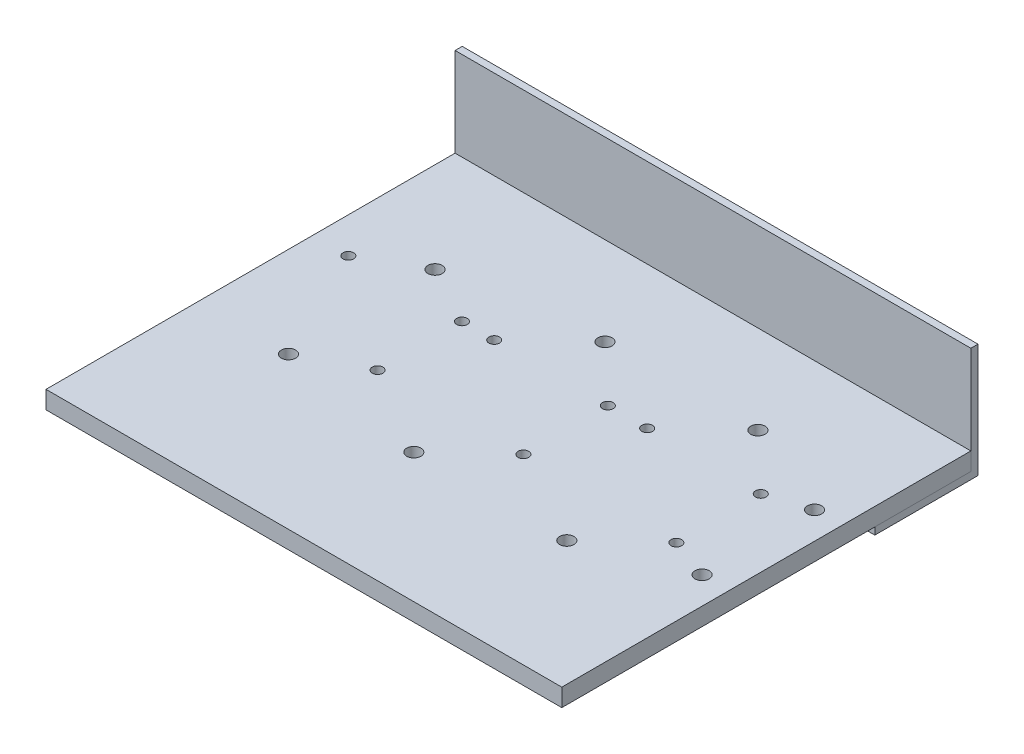
ISO-10303-21;
HEADER;
FILE_DESCRIPTION(('STEP AP214'),'2;1');
FILE_NAME('part.step','',(''),(''),'','','');
FILE_SCHEMA(('AUTOMOTIVE_DESIGN { 1 0 10303 214 1 1 1 1 }'));
ENDSEC;
DATA;
#1=APPLICATION_CONTEXT('core data for automotive mechanical design processes');
#2=APPLICATION_PROTOCOL_DEFINITION('international standard','automotive_design',2000,#1);
#3=PRODUCT_CONTEXT('',#1,'mechanical');
#4=PRODUCT('Part','Part','',(#3));
#5=PRODUCT_RELATED_PRODUCT_CATEGORY('part','',(#4));
#6=PRODUCT_DEFINITION_FORMATION('','',#4);
#7=PRODUCT_DEFINITION_CONTEXT('part definition',#1,'design');
#8=PRODUCT_DEFINITION('design','',#6,#7);
#9=PRODUCT_DEFINITION_SHAPE('','',#8);
#10=(LENGTH_UNIT() NAMED_UNIT(*) SI_UNIT(.MILLI.,.METRE.));
#11=(NAMED_UNIT(*) PLANE_ANGLE_UNIT() SI_UNIT($,.RADIAN.));
#12=(NAMED_UNIT(*) SI_UNIT($,.STERADIAN.) SOLID_ANGLE_UNIT());
#13=UNCERTAINTY_MEASURE_WITH_UNIT(LENGTH_MEASURE(1.E-05),#10,'distance_accuracy_value','');
#14=(GEOMETRIC_REPRESENTATION_CONTEXT(3) GLOBAL_UNCERTAINTY_ASSIGNED_CONTEXT((#13)) GLOBAL_UNIT_ASSIGNED_CONTEXT((#10,
#11,#12)) REPRESENTATION_CONTEXT('',''));
#15=CARTESIAN_POINT('',(0.,0.,0.));
#16=DIRECTION('',(0.,0.,1.));
#17=DIRECTION('',(1.,0.,0.));
#18=AXIS2_PLACEMENT_3D('',#15,#16,#17);
#19=CARTESIAN_POINT('',(72.5,0.,-30.5));
#20=DIRECTION('',(0.,0.,-1.));
#21=DIRECTION('',(-1.,0.,0.));
#22=AXIS2_PLACEMENT_3D('',#19,#20,#21);
#23=PLANE('',#22);
#24=DIRECTION('',(-1.,0.,0.));
#25=VECTOR('',#24,1.);
#26=CARTESIAN_POINT('',(72.5,0.,-30.5));
#27=LINE('',#26,#25);
#28=CARTESIAN_POINT('',(29.7920606326244,0.,-30.5));
#29=VERTEX_POINT('',#28);
#30=CARTESIAN_POINT('',(2.22061971478603,0.,-30.5));
#31=VERTEX_POINT('',#30);
#32=EDGE_CURVE('E145',#29,#31,#27,.T.);
#33=ORIENTED_EDGE('',*,*,#32,.T.);
#34=DIRECTION('',(0.,-1.,0.));
#35=VECTOR('',#34,1.);
#36=CARTESIAN_POINT('',(2.22061971478603,22.6274169979695,-30.5));
#37=LINE('',#36,#35);
#38=CARTESIAN_POINT('',(2.22061971478603,-2.,-30.5));
#39=VERTEX_POINT('',#38);
#40=EDGE_CURVE('E12',#31,#39,#37,.T.);
#41=ORIENTED_EDGE('',*,*,#40,.T.);
#42=DIRECTION('',(-1.,0.,0.));
#43=VECTOR('',#42,1.);
#44=CARTESIAN_POINT('',(72.5,-2.,-30.5));
#45=LINE('',#44,#43);
#46=CARTESIAN_POINT('',(29.7920606326244,-2.,-30.5));
#47=VERTEX_POINT('',#46);
#48=EDGE_CURVE('E142',#47,#39,#45,.T.);
#49=ORIENTED_EDGE('',*,*,#48,.F.);
#50=DIRECTION('',(0.,-1.,0.));
#51=VECTOR('',#50,1.);
#52=CARTESIAN_POINT('',(29.7920606326244,22.6274169979695,-30.5));
#53=LINE('',#52,#51);
#54=EDGE_CURVE('E122',#47,#29,#53,.F.);
#55=ORIENTED_EDGE('',*,*,#54,.T.);
#56=EDGE_LOOP('',(#33,#41,#49,#55));
#57=FACE_BOUND('',#56,.T.);
#58=ADVANCED_FACE('F43',(#57),#23,.F.);
#59=CARTESIAN_POINT('',(72.5,0.,-30.5));
#60=VERTEX_POINT('',#59);
#61=CARTESIAN_POINT('',(45.2206197147861,0.,-30.5));
#62=VERTEX_POINT('',#61);
#63=EDGE_CURVE('E136',#60,#62,#27,.T.);
#64=ORIENTED_EDGE('',*,*,#63,.T.);
#65=DIRECTION('',(0.,-1.,0.));
#66=VECTOR('',#65,1.);
#67=CARTESIAN_POINT('',(45.2206197147861,22.6274169979695,-30.5));
#68=LINE('',#67,#66);
#69=CARTESIAN_POINT('',(45.2206197147861,-2.,-30.5));
#70=VERTEX_POINT('',#69);
#71=EDGE_CURVE('E121',#62,#70,#68,.T.);
#72=ORIENTED_EDGE('',*,*,#71,.T.);
#73=CARTESIAN_POINT('',(72.5,-2.,-30.5));
#74=VERTEX_POINT('',#73);
#75=EDGE_CURVE('E133',#74,#70,#45,.T.);
#76=ORIENTED_EDGE('',*,*,#75,.F.);
#77=DIRECTION('',(0.,-1.,0.));
#78=VECTOR('',#77,1.);
#79=CARTESIAN_POINT('',(72.5,0.,-30.5));
#80=LINE('',#79,#78);
#81=EDGE_CURVE('E197',#60,#74,#80,.T.);
#82=ORIENTED_EDGE('',*,*,#81,.F.);
#83=EDGE_LOOP('',(#64,#72,#76,#82));
#84=FACE_BOUND('',#83,.T.);
#85=ADVANCED_FACE('F131',(#84),#23,.F.);
#86=CARTESIAN_POINT('',(72.5,-2.,-57.5));
#87=DIRECTION('',(0.,-1.,0.));
#88=DIRECTION('',(0.,0.,-1.));
#89=AXIS2_PLACEMENT_3D('',#86,#87,#88);
#90=PLANE('',#89);
#91=CARTESIAN_POINT('',(-5.49365982629481,-2.,-32.6189363279867));
#92=DIRECTION('',(0.,-1.,0.));
#93=DIRECTION('',(0.,0.,-1.));
#94=AXIS2_PLACEMENT_3D('',#91,#92,#93);
#95=CIRCLE('',#94,8.);
#96=CARTESIAN_POINT('',(-13.2079393673756,-2.,-30.5));
#97=VERTEX_POINT('',#96);
#98=EDGE_CURVE('E191',#97,#39,#95,.T.);
#99=ORIENTED_EDGE('',*,*,#98,.F.);
#100=CARTESIAN_POINT('',(-72.5,-2.,-30.5));
#101=VERTEX_POINT('',#100);
#102=EDGE_CURVE('E144',#97,#101,#45,.T.);
#103=ORIENTED_EDGE('',*,*,#102,.T.);
#104=DIRECTION('',(0.,0.,1.));
#105=VECTOR('',#104,1.);
#106=CARTESIAN_POINT('',(-72.5,-2.,-57.5));
#107=LINE('',#106,#105);
#108=CARTESIAN_POINT('',(-72.5,-2.,-59.5));
#109=VERTEX_POINT('',#108);
#110=EDGE_CURVE('E161',#109,#101,#107,.T.);
#111=ORIENTED_EDGE('',*,*,#110,.F.);
#112=DIRECTION('',(-1.,0.,0.));
#113=VECTOR('',#112,1.);
#114=CARTESIAN_POINT('',(72.5,-2.,-59.5));
#115=LINE('',#114,#113);
#116=CARTESIAN_POINT('',(72.5,-2.,-59.5));
#117=VERTEX_POINT('',#116);
#118=EDGE_CURVE('E176',#117,#109,#115,.T.);
#119=ORIENTED_EDGE('',*,*,#118,.F.);
#120=DIRECTION('',(0.,0.,1.));
#121=VECTOR('',#120,1.);
#122=CARTESIAN_POINT('',(72.5,-2.,-57.5));
#123=LINE('',#122,#121);
#124=EDGE_CURVE('E140',#117,#74,#123,.T.);
#125=ORIENTED_EDGE('',*,*,#124,.T.);
#126=ORIENTED_EDGE('',*,*,#75,.T.);
#127=CARTESIAN_POINT('',(37.5063401737052,-2.,-32.6189363279867));
#128=DIRECTION('',(0.,-1.,0.));
#129=DIRECTION('',(0.,0.,-1.));
#130=AXIS2_PLACEMENT_3D('',#127,#128,#129);
#131=CIRCLE('',#130,8.);
#132=EDGE_CURVE('E118',#47,#70,#131,.T.);
#133=ORIENTED_EDGE('',*,*,#132,.F.);
#134=ORIENTED_EDGE('',*,*,#48,.T.);
#135=EDGE_LOOP('',(#99,#103,#111,#119,#125,#126,#133,#134));
#136=FACE_BOUND('',#135,.T.);
#137=ADVANCED_FACE('F45',(#136),#90,.T.);
#138=CARTESIAN_POINT('',(72.5,0.,-59.5));
#139=DIRECTION('',(0.,0.,-1.));
#140=DIRECTION('',(-1.,0.,0.));
#141=AXIS2_PLACEMENT_3D('',#138,#139,#140);
#142=PLANE('',#141);
#143=DIRECTION('',(0.,1.,0.));
#144=VECTOR('',#143,1.);
#145=CARTESIAN_POINT('',(-72.5,0.,-59.5));
#146=LINE('',#145,#144);
#147=CARTESIAN_POINT('',(-72.5,30.,-59.5));
#148=VERTEX_POINT('',#147);
#149=EDGE_CURVE('E173',#148,#109,#146,.F.);
#150=ORIENTED_EDGE('',*,*,#149,.F.);
#151=DIRECTION('',(-1.,0.,0.));
#152=VECTOR('',#151,1.);
#153=CARTESIAN_POINT('',(72.5,30.,-59.5));
#154=LINE('',#153,#152);
#155=CARTESIAN_POINT('',(72.5,30.,-59.5));
#156=VERTEX_POINT('',#155);
#157=EDGE_CURVE('E178',#156,#148,#154,.T.);
#158=ORIENTED_EDGE('',*,*,#157,.F.);
#159=DIRECTION('',(0.,1.,0.));
#160=VECTOR('',#159,1.);
#161=CARTESIAN_POINT('',(72.5,0.,-59.5));
#162=LINE('',#161,#160);
#163=EDGE_CURVE('E148',#156,#117,#162,.F.);
#164=ORIENTED_EDGE('',*,*,#163,.T.);
#165=ORIENTED_EDGE('',*,*,#118,.T.);
#166=EDGE_LOOP('',(#150,#158,#164,#165));
#167=FACE_BOUND('',#166,.T.);
#168=ADVANCED_FACE('F243',(#167),#142,.T.);
#169=CARTESIAN_POINT('',(72.5,30.,-59.5));
#170=DIRECTION('',(0.,-1.,0.));
#171=DIRECTION('',(0.,0.,-1.));
#172=AXIS2_PLACEMENT_3D('',#169,#170,#171);
#173=PLANE('',#172);
#174=DIRECTION('',(0.,0.,1.));
#175=VECTOR('',#174,1.);
#176=CARTESIAN_POINT('',(-72.5,30.,-59.5));
#177=LINE('',#176,#175);
#178=CARTESIAN_POINT('',(-72.5,30.,-57.5));
#179=VERTEX_POINT('',#178);
#180=EDGE_CURVE('E171',#148,#179,#177,.T.);
#181=ORIENTED_EDGE('',*,*,#180,.T.);
#182=DIRECTION('',(-1.,0.,0.));
#183=VECTOR('',#182,1.);
#184=CARTESIAN_POINT('',(72.5,30.,-57.5));
#185=LINE('',#184,#183);
#186=CARTESIAN_POINT('',(72.5,30.,-57.5));
#187=VERTEX_POINT('',#186);
#188=EDGE_CURVE('E180',#187,#179,#185,.T.);
#189=ORIENTED_EDGE('',*,*,#188,.F.);
#190=DIRECTION('',(0.,0.,1.));
#191=VECTOR('',#190,1.);
#192=CARTESIAN_POINT('',(72.5,30.,-59.5));
#193=LINE('',#192,#191);
#194=EDGE_CURVE('E153',#156,#187,#193,.T.);
#195=ORIENTED_EDGE('',*,*,#194,.F.);
#196=ORIENTED_EDGE('',*,*,#157,.T.);
#197=EDGE_LOOP('',(#181,#189,#195,#196));
#198=FACE_BOUND('',#197,.T.);
#199=ADVANCED_FACE('F238',(#198),#173,.F.);
#200=CARTESIAN_POINT('',(72.5,0.,-57.5));
#201=DIRECTION('',(0.,0.,-1.));
#202=DIRECTION('',(-1.,0.,0.));
#203=AXIS2_PLACEMENT_3D('',#200,#201,#202);
#204=PLANE('',#203);
#205=DIRECTION('',(0.,-1.,0.));
#206=VECTOR('',#205,1.);
#207=CARTESIAN_POINT('',(-72.5,0.,-57.5));
#208=LINE('',#207,#206);
#209=CARTESIAN_POINT('',(-72.5,0.,-57.5));
#210=VERTEX_POINT('',#209);
#211=EDGE_CURVE('E169',#179,#210,#208,.T.);
#212=ORIENTED_EDGE('',*,*,#211,.T.);
#213=DIRECTION('',(-1.,0.,0.));
#214=VECTOR('',#213,1.);
#215=CARTESIAN_POINT('',(72.5,0.,-57.5));
#216=LINE('',#215,#214);
#217=CARTESIAN_POINT('',(72.5,0.,-57.5));
#218=VERTEX_POINT('',#217);
#219=EDGE_CURVE('E183',#218,#210,#216,.T.);
#220=ORIENTED_EDGE('',*,*,#219,.F.);
#221=DIRECTION('',(0.,-1.,0.));
#222=VECTOR('',#221,1.);
#223=CARTESIAN_POINT('',(72.5,0.,-57.5));
#224=LINE('',#223,#222);
#225=EDGE_CURVE('E157',#187,#218,#224,.T.);
#226=ORIENTED_EDGE('',*,*,#225,.F.);
#227=ORIENTED_EDGE('',*,*,#188,.T.);
#228=EDGE_LOOP('',(#212,#220,#226,#227));
#229=FACE_BOUND('',#228,.T.);
#230=ADVANCED_FACE('F208',(#229),#204,.F.);
#231=CARTESIAN_POINT('',(72.5,0.,-57.5));
#232=DIRECTION('',(0.,-1.,0.));
#233=DIRECTION('',(0.,0.,-1.));
#234=AXIS2_PLACEMENT_3D('',#231,#232,#233);
#235=PLANE('',#234);
#236=CARTESIAN_POINT('',(-13.2079393673756,0.,-30.5));
#237=VERTEX_POINT('',#236);
#238=CARTESIAN_POINT('',(-72.5,0.,-30.5));
#239=VERTEX_POINT('',#238);
#240=EDGE_CURVE('E141',#237,#239,#27,.T.);
#241=ORIENTED_EDGE('',*,*,#240,.F.);
#242=CARTESIAN_POINT('',(-5.49365982629481,0.,-32.6189363279867));
#243=DIRECTION('',(0.,1.,0.));
#244=DIRECTION('',(0.,0.,1.));
#245=AXIS2_PLACEMENT_3D('',#242,#243,#244);
#246=CIRCLE('',#245,8.);
#247=EDGE_CURVE('E58',#237,#31,#246,.F.);
#248=ORIENTED_EDGE('',*,*,#247,.T.);
#249=ORIENTED_EDGE('',*,*,#32,.F.);
#250=CARTESIAN_POINT('',(37.5063401737052,0.,-32.6189363279867));
#251=DIRECTION('',(0.,1.,0.));
#252=DIRECTION('',(0.,0.,1.));
#253=AXIS2_PLACEMENT_3D('',#250,#251,#252);
#254=CIRCLE('',#253,8.);
#255=EDGE_CURVE('E66',#29,#62,#254,.F.);
#256=ORIENTED_EDGE('',*,*,#255,.T.);
#257=ORIENTED_EDGE('',*,*,#63,.F.);
#258=DIRECTION('',(0.,0.,1.));
#259=VECTOR('',#258,1.);
#260=CARTESIAN_POINT('',(72.5,0.,-57.5));
#261=LINE('',#260,#259);
#262=EDGE_CURVE('E199',#218,#60,#261,.T.);
#263=ORIENTED_EDGE('',*,*,#262,.F.);
#264=ORIENTED_EDGE('',*,*,#219,.T.);
#265=DIRECTION('',(0.,0.,1.));
#266=VECTOR('',#265,1.);
#267=CARTESIAN_POINT('',(-72.5,0.,-57.5));
#268=LINE('',#267,#266);
#269=EDGE_CURVE('E166',#210,#239,#268,.T.);
#270=ORIENTED_EDGE('',*,*,#269,.T.);
#271=EDGE_LOOP('',(#241,#248,#249,#256,#257,#263,#264,#270));
#272=FACE_BOUND('',#271,.T.);
#273=ADVANCED_FACE('F190',(#272),#235,.F.);
#274=ORIENTED_EDGE('',*,*,#102,.F.);
#275=DIRECTION('',(0.,-1.,0.));
#276=VECTOR('',#275,1.);
#277=CARTESIAN_POINT('',(-13.2079393673756,22.6274169979695,-30.5));
#278=LINE('',#277,#276);
#279=EDGE_CURVE('E51',#97,#237,#278,.F.);
#280=ORIENTED_EDGE('',*,*,#279,.T.);
#281=ORIENTED_EDGE('',*,*,#240,.T.);
#282=DIRECTION('',(0.,-1.,0.));
#283=VECTOR('',#282,1.);
#284=CARTESIAN_POINT('',(-72.5,0.,-30.5));
#285=LINE('',#284,#283);
#286=EDGE_CURVE('E164',#239,#101,#285,.T.);
#287=ORIENTED_EDGE('',*,*,#286,.T.);
#288=EDGE_LOOP('',(#274,#280,#281,#287));
#289=FACE_BOUND('',#288,.T.);
#290=ADVANCED_FACE('F216',(#289),#23,.F.);
#291=CARTESIAN_POINT('',(72.5,0.,0.));
#292=DIRECTION('',(1.,0.,0.));
#293=DIRECTION('',(0.,0.,-1.));
#294=AXIS2_PLACEMENT_3D('',#291,#292,#293);
#295=PLANE('',#294);
#296=ORIENTED_EDGE('',*,*,#124,.F.);
#297=ORIENTED_EDGE('',*,*,#163,.F.);
#298=ORIENTED_EDGE('',*,*,#194,.T.);
#299=ORIENTED_EDGE('',*,*,#225,.T.);
#300=ORIENTED_EDGE('',*,*,#262,.T.);
#301=ORIENTED_EDGE('',*,*,#81,.T.);
#302=EDGE_LOOP('',(#296,#297,#298,#299,#300,#301));
#303=FACE_BOUND('',#302,.T.);
#304=ADVANCED_FACE('F203',(#303),#295,.T.);
#305=CARTESIAN_POINT('',(-72.5,0.,0.));
#306=DIRECTION('',(1.,0.,0.));
#307=DIRECTION('',(0.,0.,-1.));
#308=AXIS2_PLACEMENT_3D('',#305,#306,#307);
#309=PLANE('',#308);
#310=ORIENTED_EDGE('',*,*,#110,.T.);
#311=ORIENTED_EDGE('',*,*,#286,.F.);
#312=ORIENTED_EDGE('',*,*,#269,.F.);
#313=ORIENTED_EDGE('',*,*,#211,.F.);
#314=ORIENTED_EDGE('',*,*,#180,.F.);
#315=ORIENTED_EDGE('',*,*,#149,.T.);
#316=EDGE_LOOP('',(#310,#311,#312,#313,#314,#315));
#317=FACE_BOUND('',#316,.T.);
#318=ADVANCED_FACE('F213',(#317),#309,.F.);
#319=CARTESIAN_POINT('',(37.5063401737052,22.6274169979695,-32.6189363279867));
#320=DIRECTION('',(0.,-1.,0.));
#321=DIRECTION('',(0.,0.,-1.));
#322=AXIS2_PLACEMENT_3D('',#319,#320,#321);
#323=CYLINDRICAL_SURFACE('',#322,8.);
#324=ORIENTED_EDGE('',*,*,#255,.F.);
#325=ORIENTED_EDGE('',*,*,#54,.F.);
#326=ORIENTED_EDGE('',*,*,#132,.T.);
#327=ORIENTED_EDGE('',*,*,#71,.F.);
#328=EDGE_LOOP('',(#324,#325,#326,#327));
#329=FACE_BOUND('',#328,.T.);
#330=ADVANCED_FACE('F120',(#329),#323,.F.);
#331=CARTESIAN_POINT('',(-5.49365982629481,22.6274169979695,-32.6189363279867));
#332=DIRECTION('',(0.,-1.,0.));
#333=DIRECTION('',(0.,0.,-1.));
#334=AXIS2_PLACEMENT_3D('',#331,#332,#333);
#335=CYLINDRICAL_SURFACE('',#334,8.);
#336=ORIENTED_EDGE('',*,*,#247,.F.);
#337=ORIENTED_EDGE('',*,*,#279,.F.);
#338=ORIENTED_EDGE('',*,*,#98,.T.);
#339=ORIENTED_EDGE('',*,*,#40,.F.);
#340=EDGE_LOOP('',(#336,#337,#338,#339));
#341=FACE_BOUND('',#340,.T.);
#342=ADVANCED_FACE('F217',(#341),#335,.F.);
#343=CLOSED_SHELL('',(#58,#85,#137,#168,#199,#230,#273,#290,#304,#318,#330,#342));
#344=MANIFOLD_SOLID_BREP('B2',#343);
#345=CARTESIAN_POINT('',(72.5,5.,-57.5));
#346=DIRECTION('',(-1.,0.,0.));
#347=DIRECTION('',(0.,0.,1.));
#348=AXIS2_PLACEMENT_3D('',#345,#346,#347);
#349=PLANE('',#348);
#350=DIRECTION('',(0.,0.,-1.));
#351=VECTOR('',#350,1.);
#352=CARTESIAN_POINT('',(72.5,0.,-57.5));
#353=LINE('',#352,#351);
#354=CARTESIAN_POINT('',(72.5,0.,57.5));
#355=VERTEX_POINT('',#354);
#356=CARTESIAN_POINT('',(72.5,0.,-57.5));
#357=VERTEX_POINT('',#356);
#358=EDGE_CURVE('E383',#355,#357,#353,.T.);
#359=ORIENTED_EDGE('',*,*,#358,.T.);
#360=DIRECTION('',(0.,-1.,0.));
#361=VECTOR('',#360,1.);
#362=CARTESIAN_POINT('',(72.5,5.,-57.5));
#363=LINE('',#362,#361);
#364=CARTESIAN_POINT('',(72.5,5.,-57.5));
#365=VERTEX_POINT('',#364);
#366=EDGE_CURVE('E41',#365,#357,#363,.T.);
#367=ORIENTED_EDGE('',*,*,#366,.F.);
#368=DIRECTION('',(0.,0.,-1.));
#369=VECTOR('',#368,1.);
#370=CARTESIAN_POINT('',(72.5,5.,-57.5));
#371=LINE('',#370,#369);
#372=CARTESIAN_POINT('',(72.5,5.,57.5));
#373=VERTEX_POINT('',#372);
#374=EDGE_CURVE('E370',#373,#365,#371,.T.);
#375=ORIENTED_EDGE('',*,*,#374,.F.);
#376=DIRECTION('',(0.,-1.,0.));
#377=VECTOR('',#376,1.);
#378=CARTESIAN_POINT('',(72.5,5.,57.5));
#379=LINE('',#378,#377);
#380=EDGE_CURVE('E379',#373,#355,#379,.T.);
#381=ORIENTED_EDGE('',*,*,#380,.T.);
#382=EDGE_LOOP('',(#359,#367,#375,#381));
#383=FACE_BOUND('',#382,.T.);
#384=ADVANCED_FACE('F317',(#383),#349,.F.);
#385=CARTESIAN_POINT('',(-72.5,5.,-57.5));
#386=DIRECTION('',(0.,0.,1.));
#387=DIRECTION('',(1.,0.,0.));
#388=AXIS2_PLACEMENT_3D('',#385,#386,#387);
#389=PLANE('',#388);
#390=DIRECTION('',(-1.,0.,0.));
#391=VECTOR('',#390,1.);
#392=CARTESIAN_POINT('',(-72.5,0.,-57.5));
#393=LINE('',#392,#391);
#394=CARTESIAN_POINT('',(-72.5,0.,-57.5));
#395=VERTEX_POINT('',#394);
#396=EDGE_CURVE('E374',#357,#395,#393,.T.);
#397=ORIENTED_EDGE('',*,*,#396,.T.);
#398=DIRECTION('',(0.,-1.,0.));
#399=VECTOR('',#398,1.);
#400=CARTESIAN_POINT('',(-72.5,5.,-57.5));
#401=LINE('',#400,#399);
#402=CARTESIAN_POINT('',(-72.5,5.,-57.5));
#403=VERTEX_POINT('',#402);
#404=EDGE_CURVE('E326',#403,#395,#401,.T.);
#405=ORIENTED_EDGE('',*,*,#404,.F.);
#406=DIRECTION('',(-1.,0.,0.));
#407=VECTOR('',#406,1.);
#408=CARTESIAN_POINT('',(-72.5,5.,-57.5));
#409=LINE('',#408,#407);
#410=EDGE_CURVE('E365',#365,#403,#409,.T.);
#411=ORIENTED_EDGE('',*,*,#410,.F.);
#412=ORIENTED_EDGE('',*,*,#366,.T.);
#413=EDGE_LOOP('',(#397,#405,#411,#412));
#414=FACE_BOUND('',#413,.T.);
#415=ADVANCED_FACE('F373',(#414),#389,.F.);
#416=CARTESIAN_POINT('',(-72.5,5.,-57.5));
#417=DIRECTION('',(1.,0.,0.));
#418=DIRECTION('',(0.,0.,-1.));
#419=AXIS2_PLACEMENT_3D('',#416,#417,#418);
#420=PLANE('',#419);
#421=DIRECTION('',(0.,0.,1.));
#422=VECTOR('',#421,1.);
#423=CARTESIAN_POINT('',(-72.5,0.,-57.5));
#424=LINE('',#423,#422);
#425=CARTESIAN_POINT('',(-72.5,0.,57.5));
#426=VERTEX_POINT('',#425);
#427=EDGE_CURVE('E352',#395,#426,#424,.T.);
#428=ORIENTED_EDGE('',*,*,#427,.T.);
#429=DIRECTION('',(0.,-1.,0.));
#430=VECTOR('',#429,1.);
#431=CARTESIAN_POINT('',(-72.5,5.,57.5));
#432=LINE('',#431,#430);
#433=CARTESIAN_POINT('',(-72.5,5.,57.5));
#434=VERTEX_POINT('',#433);
#435=EDGE_CURVE('E375',#434,#426,#432,.T.);
#436=ORIENTED_EDGE('',*,*,#435,.F.);
#437=DIRECTION('',(0.,0.,1.));
#438=VECTOR('',#437,1.);
#439=CARTESIAN_POINT('',(-72.5,5.,-57.5));
#440=LINE('',#439,#438);
#441=EDGE_CURVE('E368',#403,#434,#440,.T.);
#442=ORIENTED_EDGE('',*,*,#441,.F.);
#443=ORIENTED_EDGE('',*,*,#404,.T.);
#444=EDGE_LOOP('',(#428,#436,#442,#443));
#445=FACE_BOUND('',#444,.T.);
#446=ADVANCED_FACE('F377',(#445),#420,.F.);
#447=CARTESIAN_POINT('',(-72.5,5.,57.5));
#448=DIRECTION('',(0.,0.,-1.));
#449=DIRECTION('',(-1.,0.,0.));
#450=AXIS2_PLACEMENT_3D('',#447,#448,#449);
#451=PLANE('',#450);
#452=DIRECTION('',(1.,0.,0.));
#453=VECTOR('',#452,1.);
#454=CARTESIAN_POINT('',(-72.5,0.,57.5));
#455=LINE('',#454,#453);
#456=EDGE_CURVE('E358',#426,#355,#455,.T.);
#457=ORIENTED_EDGE('',*,*,#456,.T.);
#458=ORIENTED_EDGE('',*,*,#380,.F.);
#459=DIRECTION('',(1.,0.,0.));
#460=VECTOR('',#459,1.);
#461=CARTESIAN_POINT('',(-72.5,5.,57.5));
#462=LINE('',#461,#460);
#463=EDGE_CURVE('E335',#434,#373,#462,.T.);
#464=ORIENTED_EDGE('',*,*,#463,.F.);
#465=ORIENTED_EDGE('',*,*,#435,.T.);
#466=EDGE_LOOP('',(#457,#458,#464,#465));
#467=FACE_BOUND('',#466,.T.);
#468=ADVANCED_FACE('F499',(#467),#451,.F.);
#469=CARTESIAN_POINT('',(0.,5.,0.));
#470=DIRECTION('',(0.,1.,0.));
#471=DIRECTION('',(0.,0.,1.));
#472=AXIS2_PLACEMENT_3D('',#469,#470,#471);
#473=PLANE('',#472);
#474=CARTESIAN_POINT('',(37.5063401737052,5.,21.1029859262763));
#475=DIRECTION('',(0.,1.,0.));
#476=DIRECTION('',(0.,0.,1.));
#477=AXIS2_PLACEMENT_3D('',#474,#475,#476);
#478=CIRCLE('',#477,2.);
#479=CARTESIAN_POINT('',(37.5063401737052,5.,23.1029859262763));
#480=VERTEX_POINT('',#479);
#481=EDGE_CURVE('E462',#480,#480,#478,.T.);
#482=ORIENTED_EDGE('',*,*,#481,.F.);
#483=EDGE_LOOP('',(#482));
#484=FACE_BOUND('',#483,.T.);
#485=CARTESIAN_POINT('',(-5.49365982629481,5.,21.1029859262763));
#486=DIRECTION('',(0.,1.,0.));
#487=DIRECTION('',(0.,0.,1.));
#488=AXIS2_PLACEMENT_3D('',#485,#486,#487);
#489=CIRCLE('',#488,2.);
#490=CARTESIAN_POINT('',(-5.49365982629481,5.,23.1029859262763));
#491=VERTEX_POINT('',#490);
#492=EDGE_CURVE('E452',#491,#491,#489,.T.);
#493=ORIENTED_EDGE('',*,*,#492,.F.);
#494=EDGE_LOOP('',(#493));
#495=FACE_BOUND('',#494,.T.);
#496=CARTESIAN_POINT('',(37.5063401737052,5.,-32.6189363279867));
#497=DIRECTION('',(0.,1.,0.));
#498=DIRECTION('',(0.,0.,1.));
#499=AXIS2_PLACEMENT_3D('',#496,#497,#498);
#500=CIRCLE('',#499,2.);
#501=CARTESIAN_POINT('',(37.5063401737052,5.,-30.6189363279867));
#502=VERTEX_POINT('',#501);
#503=EDGE_CURVE('E449',#502,#502,#500,.T.);
#504=ORIENTED_EDGE('',*,*,#503,.F.);
#505=EDGE_LOOP('',(#504));
#506=FACE_BOUND('',#505,.T.);
#507=CARTESIAN_POINT('',(-5.49365982629481,5.,-32.6189363279867));
#508=DIRECTION('',(0.,1.,0.));
#509=DIRECTION('',(0.,0.,1.));
#510=AXIS2_PLACEMENT_3D('',#507,#508,#509);
#511=CIRCLE('',#510,2.);
#512=CARTESIAN_POINT('',(-5.49365982629481,5.,-30.6189363279867));
#513=VERTEX_POINT('',#512);
#514=EDGE_CURVE('E446',#513,#513,#511,.T.);
#515=ORIENTED_EDGE('',*,*,#514,.F.);
#516=EDGE_LOOP('',(#515));
#517=FACE_BOUND('',#516,.T.);
#518=CARTESIAN_POINT('',(-46.9936598262948,5.,-26.3586665893261));
#519=DIRECTION('',(0.,1.,0.));
#520=DIRECTION('',(0.,0.,1.));
#521=AXIS2_PLACEMENT_3D('',#518,#519,#520);
#522=CIRCLE('',#521,2.);
#523=CARTESIAN_POINT('',(-46.9936598262948,5.,-24.3586665893261));
#524=VERTEX_POINT('',#523);
#525=EDGE_CURVE('E442',#524,#524,#522,.T.);
#526=ORIENTED_EDGE('',*,*,#525,.F.);
#527=EDGE_LOOP('',(#526));
#528=FACE_BOUND('',#527,.T.);
#529=CARTESIAN_POINT('',(-46.9936598262948,5.,14.8427161876158));
#530=DIRECTION('',(0.,1.,0.));
#531=DIRECTION('',(0.,0.,1.));
#532=AXIS2_PLACEMENT_3D('',#529,#530,#531);
#533=CIRCLE('',#532,2.);
#534=CARTESIAN_POINT('',(-46.9936598262948,5.,16.8427161876158));
#535=VERTEX_POINT('',#534);
#536=EDGE_CURVE('E438',#535,#535,#533,.T.);
#537=ORIENTED_EDGE('',*,*,#536,.F.);
#538=EDGE_LOOP('',(#537));
#539=FACE_BOUND('',#538,.T.);
#540=CARTESIAN_POINT('',(64.8700841736506,5.,10.4379256689186));
#541=DIRECTION('',(0.,1.,0.));
#542=DIRECTION('',(0.,0.,-1.));
#543=AXIS2_PLACEMENT_3D('',#540,#541,#542);
#544=CIRCLE('',#543,2.);
#545=CARTESIAN_POINT('',(64.8700841736506,5.,8.43792566891863));
#546=VERTEX_POINT('',#545);
#547=EDGE_CURVE('E434',#546,#546,#544,.T.);
#548=ORIENTED_EDGE('',*,*,#547,.F.);
#549=EDGE_LOOP('',(#548));
#550=FACE_BOUND('',#549,.T.);
#551=CARTESIAN_POINT('',(64.8700841736506,5.,-21.1792950022769));
#552=DIRECTION('',(0.,1.,0.));
#553=DIRECTION('',(0.,0.,1.));
#554=AXIS2_PLACEMENT_3D('',#551,#552,#553);
#555=CIRCLE('',#554,2.);
#556=CARTESIAN_POINT('',(64.8700841736506,5.,-19.1792950022769));
#557=VERTEX_POINT('',#556);
#558=EDGE_CURVE('E430',#557,#557,#555,.T.);
#559=ORIENTED_EDGE('',*,*,#558,.F.);
#560=EDGE_LOOP('',(#559));
#561=FACE_BOUND('',#560,.T.);
#562=CARTESIAN_POINT('',(53.431840245523,5.,6.22656990395187));
#563=DIRECTION('',(0.,1.,0.));
#564=DIRECTION('',(0.,0.,1.));
#565=AXIS2_PLACEMENT_3D('',#562,#563,#564);
#566=CIRCLE('',#565,1.5);
#567=CARTESIAN_POINT('',(53.431840245523,5.,7.72656990395187));
#568=VERTEX_POINT('',#567);
#569=EDGE_CURVE('E426',#568,#568,#566,.T.);
#570=ORIENTED_EDGE('',*,*,#569,.F.);
#571=EDGE_LOOP('',(#570));
#572=FACE_BOUND('',#571,.T.);
#573=CARTESIAN_POINT('',(53.431840245523,5.,-17.5));
#574=DIRECTION('',(0.,1.,0.));
#575=DIRECTION('',(0.,0.,1.));
#576=AXIS2_PLACEMENT_3D('',#573,#574,#575);
#577=CIRCLE('',#576,1.5);
#578=CARTESIAN_POINT('',(53.431840245523,5.,-16.));
#579=VERTEX_POINT('',#578);
#580=EDGE_CURVE('E422',#579,#579,#577,.T.);
#581=ORIENTED_EDGE('',*,*,#580,.F.);
#582=EDGE_LOOP('',(#581));
#583=FACE_BOUND('',#582,.T.);
#584=CARTESIAN_POINT('',(21.5,5.,-17.5));
#585=DIRECTION('',(0.,1.,0.));
#586=DIRECTION('',(0.,0.,1.));
#587=AXIS2_PLACEMENT_3D('',#584,#585,#586);
#588=CIRCLE('',#587,1.5);
#589=CARTESIAN_POINT('',(21.5,5.,-16.));
#590=VERTEX_POINT('',#589);
#591=EDGE_CURVE('E418',#590,#590,#588,.T.);
#592=ORIENTED_EDGE('',*,*,#591,.F.);
#593=EDGE_LOOP('',(#592));
#594=FACE_BOUND('',#593,.T.);
#595=CARTESIAN_POINT('',(10.431840245523,5.,6.22656990395187));
#596=DIRECTION('',(0.,1.,0.));
#597=DIRECTION('',(0.,0.,1.));
#598=AXIS2_PLACEMENT_3D('',#595,#596,#597);
#599=CIRCLE('',#598,1.5);
#600=CARTESIAN_POINT('',(10.431840245523,5.,7.72656990395187));
#601=VERTEX_POINT('',#600);
#602=EDGE_CURVE('E414',#601,#601,#599,.T.);
#603=ORIENTED_EDGE('',*,*,#602,.F.);
#604=EDGE_LOOP('',(#603));
#605=FACE_BOUND('',#604,.T.);
#606=CARTESIAN_POINT('',(10.431840245523,5.,-17.5));
#607=DIRECTION('',(0.,1.,0.));
#608=DIRECTION('',(0.,0.,1.));
#609=AXIS2_PLACEMENT_3D('',#606,#607,#608);
#610=CIRCLE('',#609,1.5);
#611=CARTESIAN_POINT('',(10.431840245523,5.,-16.));
#612=VERTEX_POINT('',#611);
#613=EDGE_CURVE('E410',#612,#612,#610,.T.);
#614=ORIENTED_EDGE('',*,*,#613,.F.);
#615=EDGE_LOOP('',(#614));
#616=FACE_BOUND('',#615,.T.);
#617=CARTESIAN_POINT('',(-21.5,5.,-17.5));
#618=DIRECTION('',(0.,1.,0.));
#619=DIRECTION('',(0.,0.,1.));
#620=AXIS2_PLACEMENT_3D('',#617,#618,#619);
#621=CIRCLE('',#620,1.5);
#622=CARTESIAN_POINT('',(-21.5,5.,-16.));
#623=VERTEX_POINT('',#622);
#624=EDGE_CURVE('E406',#623,#623,#621,.T.);
#625=ORIENTED_EDGE('',*,*,#624,.F.);
#626=EDGE_LOOP('',(#625));
#627=FACE_BOUND('',#626,.T.);
#628=CARTESIAN_POINT('',(-30.568159754477,5.,6.22656990395187));
#629=DIRECTION('',(0.,1.,0.));
#630=DIRECTION('',(0.,0.,1.));
#631=AXIS2_PLACEMENT_3D('',#628,#629,#630);
#632=CIRCLE('',#631,1.5);
#633=CARTESIAN_POINT('',(-30.568159754477,5.,7.72656990395186));
#634=VERTEX_POINT('',#633);
#635=EDGE_CURVE('E402',#634,#634,#632,.T.);
#636=ORIENTED_EDGE('',*,*,#635,.F.);
#637=EDGE_LOOP('',(#636));
#638=FACE_BOUND('',#637,.T.);
#639=CARTESIAN_POINT('',(-30.568159754477,5.,-17.5));
#640=DIRECTION('',(0.,1.,0.));
#641=DIRECTION('',(0.,0.,1.));
#642=AXIS2_PLACEMENT_3D('',#639,#640,#641);
#643=CIRCLE('',#642,1.5);
#644=CARTESIAN_POINT('',(-30.568159754477,5.,-16.));
#645=VERTEX_POINT('',#644);
#646=EDGE_CURVE('E398',#645,#645,#643,.T.);
#647=ORIENTED_EDGE('',*,*,#646,.F.);
#648=EDGE_LOOP('',(#647));
#649=FACE_BOUND('',#648,.T.);
#650=CARTESIAN_POINT('',(-62.5,5.,-17.5));
#651=DIRECTION('',(0.,1.,0.));
#652=DIRECTION('',(0.,0.,1.));
#653=AXIS2_PLACEMENT_3D('',#650,#651,#652);
#654=CIRCLE('',#653,1.5);
#655=CARTESIAN_POINT('',(-62.5,5.,-16.));
#656=VERTEX_POINT('',#655);
#657=EDGE_CURVE('E394',#656,#656,#654,.T.);
#658=ORIENTED_EDGE('',*,*,#657,.F.);
#659=EDGE_LOOP('',(#658));
#660=FACE_BOUND('',#659,.T.);
#661=ORIENTED_EDGE('',*,*,#374,.T.);
#662=ORIENTED_EDGE('',*,*,#410,.T.);
#663=ORIENTED_EDGE('',*,*,#441,.T.);
#664=ORIENTED_EDGE('',*,*,#463,.T.);
#665=EDGE_LOOP('',(#661,#662,#663,#664));
#666=FACE_BOUND('',#665,.T.);
#667=ADVANCED_FACE('F366',(#484,#495,#506,#517,#528,#539,#550,#561,#572,#583,#594,#605,#616,
#627,#638,#649,#660,#666),#473,.T.);
#668=CARTESIAN_POINT('',(0.,0.,0.));
#669=DIRECTION('',(0.,1.,0.));
#670=DIRECTION('',(0.,0.,1.));
#671=AXIS2_PLACEMENT_3D('',#668,#669,#670);
#672=PLANE('',#671);
#673=CARTESIAN_POINT('',(37.5063401737052,0.,21.1029859262763));
#674=DIRECTION('',(0.,1.,0.));
#675=DIRECTION('',(0.,0.,1.));
#676=AXIS2_PLACEMENT_3D('',#673,#674,#675);
#677=CIRCLE('',#676,2.);
#678=CARTESIAN_POINT('',(37.5063401737052,0.,23.1029859262763));
#679=VERTEX_POINT('',#678);
#680=EDGE_CURVE('E320',#679,#679,#677,.T.);
#681=ORIENTED_EDGE('',*,*,#680,.T.);
#682=EDGE_LOOP('',(#681));
#683=FACE_BOUND('',#682,.T.);
#684=CARTESIAN_POINT('',(-5.49365982629481,0.,21.1029859262763));
#685=DIRECTION('',(0.,1.,0.));
#686=DIRECTION('',(0.,0.,1.));
#687=AXIS2_PLACEMENT_3D('',#684,#685,#686);
#688=CIRCLE('',#687,2.);
#689=CARTESIAN_POINT('',(-5.49365982629481,0.,23.1029859262763));
#690=VERTEX_POINT('',#689);
#691=EDGE_CURVE('E450',#690,#690,#688,.T.);
#692=ORIENTED_EDGE('',*,*,#691,.T.);
#693=EDGE_LOOP('',(#692));
#694=FACE_BOUND('',#693,.T.);
#695=CARTESIAN_POINT('',(-46.9936598262948,0.,-26.3586665893261));
#696=DIRECTION('',(0.,1.,0.));
#697=DIRECTION('',(0.,0.,1.));
#698=AXIS2_PLACEMENT_3D('',#695,#696,#697);
#699=CIRCLE('',#698,2.);
#700=CARTESIAN_POINT('',(-46.9936598262948,0.,-24.3586665893261));
#701=VERTEX_POINT('',#700);
#702=EDGE_CURVE('E439',#701,#701,#699,.T.);
#703=ORIENTED_EDGE('',*,*,#702,.T.);
#704=EDGE_LOOP('',(#703));
#705=FACE_BOUND('',#704,.T.);
#706=CARTESIAN_POINT('',(-46.9936598262948,0.,14.8427161876158));
#707=DIRECTION('',(0.,1.,0.));
#708=DIRECTION('',(0.,0.,1.));
#709=AXIS2_PLACEMENT_3D('',#706,#707,#708);
#710=CIRCLE('',#709,2.);
#711=CARTESIAN_POINT('',(-46.9936598262948,0.,16.8427161876158));
#712=VERTEX_POINT('',#711);
#713=EDGE_CURVE('E435',#712,#712,#710,.T.);
#714=ORIENTED_EDGE('',*,*,#713,.T.);
#715=EDGE_LOOP('',(#714));
#716=FACE_BOUND('',#715,.T.);
#717=CARTESIAN_POINT('',(64.8700841736506,0.,10.4379256689186));
#718=DIRECTION('',(0.,1.,0.));
#719=DIRECTION('',(0.,0.,1.));
#720=AXIS2_PLACEMENT_3D('',#717,#718,#719);
#721=CIRCLE('',#720,2.);
#722=CARTESIAN_POINT('',(64.8700841736506,0.,12.4379256689186));
#723=VERTEX_POINT('',#722);
#724=EDGE_CURVE('E431',#723,#723,#721,.T.);
#725=ORIENTED_EDGE('',*,*,#724,.T.);
#726=EDGE_LOOP('',(#725));
#727=FACE_BOUND('',#726,.T.);
#728=CARTESIAN_POINT('',(64.8700841736506,0.,-21.1792950022769));
#729=DIRECTION('',(0.,1.,0.));
#730=DIRECTION('',(0.,0.,1.));
#731=AXIS2_PLACEMENT_3D('',#728,#729,#730);
#732=CIRCLE('',#731,2.);
#733=CARTESIAN_POINT('',(64.8700841736506,0.,-19.1792950022769));
#734=VERTEX_POINT('',#733);
#735=EDGE_CURVE('E427',#734,#734,#732,.T.);
#736=ORIENTED_EDGE('',*,*,#735,.T.);
#737=EDGE_LOOP('',(#736));
#738=FACE_BOUND('',#737,.T.);
#739=CARTESIAN_POINT('',(53.431840245523,0.,6.22656990395187));
#740=DIRECTION('',(0.,1.,0.));
#741=DIRECTION('',(0.,0.,1.));
#742=AXIS2_PLACEMENT_3D('',#739,#740,#741);
#743=CIRCLE('',#742,1.5);
#744=CARTESIAN_POINT('',(53.431840245523,0.,7.72656990395187));
#745=VERTEX_POINT('',#744);
#746=EDGE_CURVE('E423',#745,#745,#743,.T.);
#747=ORIENTED_EDGE('',*,*,#746,.T.);
#748=EDGE_LOOP('',(#747));
#749=FACE_BOUND('',#748,.T.);
#750=CARTESIAN_POINT('',(53.431840245523,0.,-17.5));
#751=DIRECTION('',(0.,1.,0.));
#752=DIRECTION('',(0.,0.,1.));
#753=AXIS2_PLACEMENT_3D('',#750,#751,#752);
#754=CIRCLE('',#753,1.5);
#755=CARTESIAN_POINT('',(53.431840245523,0.,-16.));
#756=VERTEX_POINT('',#755);
#757=EDGE_CURVE('E419',#756,#756,#754,.T.);
#758=ORIENTED_EDGE('',*,*,#757,.T.);
#759=EDGE_LOOP('',(#758));
#760=FACE_BOUND('',#759,.T.);
#761=CARTESIAN_POINT('',(21.5,0.,-17.5));
#762=DIRECTION('',(0.,1.,0.));
#763=DIRECTION('',(0.,0.,1.));
#764=AXIS2_PLACEMENT_3D('',#761,#762,#763);
#765=CIRCLE('',#764,1.5);
#766=CARTESIAN_POINT('',(21.5,0.,-16.));
#767=VERTEX_POINT('',#766);
#768=EDGE_CURVE('E415',#767,#767,#765,.T.);
#769=ORIENTED_EDGE('',*,*,#768,.T.);
#770=EDGE_LOOP('',(#769));
#771=FACE_BOUND('',#770,.T.);
#772=CARTESIAN_POINT('',(10.431840245523,0.,6.22656990395187));
#773=DIRECTION('',(0.,1.,0.));
#774=DIRECTION('',(0.,0.,1.));
#775=AXIS2_PLACEMENT_3D('',#772,#773,#774);
#776=CIRCLE('',#775,1.5);
#777=CARTESIAN_POINT('',(10.431840245523,0.,7.72656990395187));
#778=VERTEX_POINT('',#777);
#779=EDGE_CURVE('E411',#778,#778,#776,.T.);
#780=ORIENTED_EDGE('',*,*,#779,.T.);
#781=EDGE_LOOP('',(#780));
#782=FACE_BOUND('',#781,.T.);
#783=CARTESIAN_POINT('',(10.431840245523,0.,-17.5));
#784=DIRECTION('',(0.,1.,0.));
#785=DIRECTION('',(0.,0.,1.));
#786=AXIS2_PLACEMENT_3D('',#783,#784,#785);
#787=CIRCLE('',#786,1.5);
#788=CARTESIAN_POINT('',(10.431840245523,0.,-16.));
#789=VERTEX_POINT('',#788);
#790=EDGE_CURVE('E407',#789,#789,#787,.T.);
#791=ORIENTED_EDGE('',*,*,#790,.T.);
#792=EDGE_LOOP('',(#791));
#793=FACE_BOUND('',#792,.T.);
#794=CARTESIAN_POINT('',(-21.5,0.,-17.5));
#795=DIRECTION('',(0.,1.,0.));
#796=DIRECTION('',(0.,0.,1.));
#797=AXIS2_PLACEMENT_3D('',#794,#795,#796);
#798=CIRCLE('',#797,1.5);
#799=CARTESIAN_POINT('',(-21.5,0.,-16.));
#800=VERTEX_POINT('',#799);
#801=EDGE_CURVE('E403',#800,#800,#798,.T.);
#802=ORIENTED_EDGE('',*,*,#801,.T.);
#803=EDGE_LOOP('',(#802));
#804=FACE_BOUND('',#803,.T.);
#805=CARTESIAN_POINT('',(-30.568159754477,0.,6.22656990395187));
#806=DIRECTION('',(0.,1.,0.));
#807=DIRECTION('',(0.,0.,1.));
#808=AXIS2_PLACEMENT_3D('',#805,#806,#807);
#809=CIRCLE('',#808,1.5);
#810=CARTESIAN_POINT('',(-30.568159754477,0.,7.72656990395186));
#811=VERTEX_POINT('',#810);
#812=EDGE_CURVE('E399',#811,#811,#809,.T.);
#813=ORIENTED_EDGE('',*,*,#812,.T.);
#814=EDGE_LOOP('',(#813));
#815=FACE_BOUND('',#814,.T.);
#816=CARTESIAN_POINT('',(-30.568159754477,0.,-17.5));
#817=DIRECTION('',(0.,1.,0.));
#818=DIRECTION('',(0.,0.,1.));
#819=AXIS2_PLACEMENT_3D('',#816,#817,#818);
#820=CIRCLE('',#819,1.5);
#821=CARTESIAN_POINT('',(-30.568159754477,0.,-16.));
#822=VERTEX_POINT('',#821);
#823=EDGE_CURVE('E395',#822,#822,#820,.T.);
#824=ORIENTED_EDGE('',*,*,#823,.T.);
#825=EDGE_LOOP('',(#824));
#826=FACE_BOUND('',#825,.T.);
#827=CARTESIAN_POINT('',(-62.5,0.,-17.5));
#828=DIRECTION('',(0.,1.,0.));
#829=DIRECTION('',(0.,0.,1.));
#830=AXIS2_PLACEMENT_3D('',#827,#828,#829);
#831=CIRCLE('',#830,1.5);
#832=CARTESIAN_POINT('',(-62.5,0.,-16.));
#833=VERTEX_POINT('',#832);
#834=EDGE_CURVE('E386',#833,#833,#831,.T.);
#835=ORIENTED_EDGE('',*,*,#834,.T.);
#836=EDGE_LOOP('',(#835));
#837=FACE_BOUND('',#836,.T.);
#838=ORIENTED_EDGE('',*,*,#358,.F.);
#839=ORIENTED_EDGE('',*,*,#456,.F.);
#840=ORIENTED_EDGE('',*,*,#427,.F.);
#841=ORIENTED_EDGE('',*,*,#396,.F.);
#842=EDGE_LOOP('',(#838,#839,#840,#841));
#843=FACE_BOUND('',#842,.T.);
#844=CARTESIAN_POINT('',(37.5063401737052,0.,-32.6189363279867));
#845=DIRECTION('',(0.,1.,0.));
#846=DIRECTION('',(0.,0.,1.));
#847=AXIS2_PLACEMENT_3D('',#844,#845,#846);
#848=CIRCLE('',#847,2.);
#849=CARTESIAN_POINT('',(37.5063401737052,0.,-30.6189363279867));
#850=VERTEX_POINT('',#849);
#851=EDGE_CURVE('E447',#850,#850,#848,.T.);
#852=ORIENTED_EDGE('',*,*,#851,.T.);
#853=EDGE_LOOP('',(#852));
#854=FACE_BOUND('',#853,.T.);
#855=CARTESIAN_POINT('',(-5.49365982629481,0.,-32.6189363279867));
#856=DIRECTION('',(0.,1.,0.));
#857=DIRECTION('',(0.,0.,1.));
#858=AXIS2_PLACEMENT_3D('',#855,#856,#857);
#859=CIRCLE('',#858,2.);
#860=CARTESIAN_POINT('',(-5.49365982629481,0.,-30.6189363279867));
#861=VERTEX_POINT('',#860);
#862=EDGE_CURVE('E443',#861,#861,#859,.T.);
#863=ORIENTED_EDGE('',*,*,#862,.T.);
#864=EDGE_LOOP('',(#863));
#865=FACE_BOUND('',#864,.T.);
#866=ADVANCED_FACE('F498',(#683,#694,#705,#716,#727,#738,#749,#760,#771,#782,#793,#804,#815,
#826,#837,#843,#854,#865),#672,.F.);
#867=CARTESIAN_POINT('',(-62.5,-2.,-17.5));
#868=DIRECTION('',(0.,1.,0.));
#869=DIRECTION('',(0.,0.,1.));
#870=AXIS2_PLACEMENT_3D('',#867,#868,#869);
#871=CYLINDRICAL_SURFACE('',#870,1.5);
#872=ORIENTED_EDGE('',*,*,#657,.T.);
#873=EDGE_LOOP('',(#872));
#874=FACE_BOUND('',#873,.T.);
#875=ORIENTED_EDGE('',*,*,#834,.F.);
#876=EDGE_LOOP('',(#875));
#877=FACE_BOUND('',#876,.T.);
#878=ADVANCED_FACE('F494',(#874,#877),#871,.F.);
#879=CARTESIAN_POINT('',(-30.568159754477,-2.,-17.5));
#880=DIRECTION('',(0.,1.,0.));
#881=DIRECTION('',(0.,0.,1.));
#882=AXIS2_PLACEMENT_3D('',#879,#880,#881);
#883=CYLINDRICAL_SURFACE('',#882,1.5);
#884=ORIENTED_EDGE('',*,*,#646,.T.);
#885=EDGE_LOOP('',(#884));
#886=FACE_BOUND('',#885,.T.);
#887=ORIENTED_EDGE('',*,*,#823,.F.);
#888=EDGE_LOOP('',(#887));
#889=FACE_BOUND('',#888,.T.);
#890=ADVANCED_FACE('F580',(#886,#889),#883,.F.);
#891=CARTESIAN_POINT('',(-30.568159754477,-2.,6.22656990395187));
#892=DIRECTION('',(0.,1.,0.));
#893=DIRECTION('',(0.,0.,1.));
#894=AXIS2_PLACEMENT_3D('',#891,#892,#893);
#895=CYLINDRICAL_SURFACE('',#894,1.5);
#896=ORIENTED_EDGE('',*,*,#635,.T.);
#897=EDGE_LOOP('',(#896));
#898=FACE_BOUND('',#897,.T.);
#899=ORIENTED_EDGE('',*,*,#812,.F.);
#900=EDGE_LOOP('',(#899));
#901=FACE_BOUND('',#900,.T.);
#902=ADVANCED_FACE('F576',(#898,#901),#895,.F.);
#903=CARTESIAN_POINT('',(-21.5,-2.,-17.5));
#904=DIRECTION('',(0.,1.,0.));
#905=DIRECTION('',(0.,0.,1.));
#906=AXIS2_PLACEMENT_3D('',#903,#904,#905);
#907=CYLINDRICAL_SURFACE('',#906,1.5);
#908=ORIENTED_EDGE('',*,*,#624,.T.);
#909=EDGE_LOOP('',(#908));
#910=FACE_BOUND('',#909,.T.);
#911=ORIENTED_EDGE('',*,*,#801,.F.);
#912=EDGE_LOOP('',(#911));
#913=FACE_BOUND('',#912,.T.);
#914=ADVANCED_FACE('F572',(#910,#913),#907,.F.);
#915=CARTESIAN_POINT('',(10.431840245523,-2.,-17.5));
#916=DIRECTION('',(0.,1.,0.));
#917=DIRECTION('',(0.,0.,1.));
#918=AXIS2_PLACEMENT_3D('',#915,#916,#917);
#919=CYLINDRICAL_SURFACE('',#918,1.5);
#920=ORIENTED_EDGE('',*,*,#613,.T.);
#921=EDGE_LOOP('',(#920));
#922=FACE_BOUND('',#921,.T.);
#923=ORIENTED_EDGE('',*,*,#790,.F.);
#924=EDGE_LOOP('',(#923));
#925=FACE_BOUND('',#924,.T.);
#926=ADVANCED_FACE('F568',(#922,#925),#919,.F.);
#927=CARTESIAN_POINT('',(10.431840245523,-2.,6.22656990395187));
#928=DIRECTION('',(0.,1.,0.));
#929=DIRECTION('',(0.,0.,1.));
#930=AXIS2_PLACEMENT_3D('',#927,#928,#929);
#931=CYLINDRICAL_SURFACE('',#930,1.5);
#932=ORIENTED_EDGE('',*,*,#602,.T.);
#933=EDGE_LOOP('',(#932));
#934=FACE_BOUND('',#933,.T.);
#935=ORIENTED_EDGE('',*,*,#779,.F.);
#936=EDGE_LOOP('',(#935));
#937=FACE_BOUND('',#936,.T.);
#938=ADVANCED_FACE('F564',(#934,#937),#931,.F.);
#939=CARTESIAN_POINT('',(21.5,-2.,-17.5));
#940=DIRECTION('',(0.,1.,0.));
#941=DIRECTION('',(0.,0.,1.));
#942=AXIS2_PLACEMENT_3D('',#939,#940,#941);
#943=CYLINDRICAL_SURFACE('',#942,1.5);
#944=ORIENTED_EDGE('',*,*,#591,.T.);
#945=EDGE_LOOP('',(#944));
#946=FACE_BOUND('',#945,.T.);
#947=ORIENTED_EDGE('',*,*,#768,.F.);
#948=EDGE_LOOP('',(#947));
#949=FACE_BOUND('',#948,.T.);
#950=ADVANCED_FACE('F560',(#946,#949),#943,.F.);
#951=CARTESIAN_POINT('',(53.431840245523,-2.,-17.5));
#952=DIRECTION('',(0.,1.,0.));
#953=DIRECTION('',(0.,0.,1.));
#954=AXIS2_PLACEMENT_3D('',#951,#952,#953);
#955=CYLINDRICAL_SURFACE('',#954,1.5);
#956=ORIENTED_EDGE('',*,*,#580,.T.);
#957=EDGE_LOOP('',(#956));
#958=FACE_BOUND('',#957,.T.);
#959=ORIENTED_EDGE('',*,*,#757,.F.);
#960=EDGE_LOOP('',(#959));
#961=FACE_BOUND('',#960,.T.);
#962=ADVANCED_FACE('F556',(#958,#961),#955,.F.);
#963=CARTESIAN_POINT('',(53.431840245523,-2.,6.22656990395187));
#964=DIRECTION('',(0.,1.,0.));
#965=DIRECTION('',(0.,0.,1.));
#966=AXIS2_PLACEMENT_3D('',#963,#964,#965);
#967=CYLINDRICAL_SURFACE('',#966,1.5);
#968=ORIENTED_EDGE('',*,*,#569,.T.);
#969=EDGE_LOOP('',(#968));
#970=FACE_BOUND('',#969,.T.);
#971=ORIENTED_EDGE('',*,*,#746,.F.);
#972=EDGE_LOOP('',(#971));
#973=FACE_BOUND('',#972,.T.);
#974=ADVANCED_FACE('F552',(#970,#973),#967,.F.);
#975=CARTESIAN_POINT('',(64.8700841736506,-2.,-21.1792950022769));
#976=DIRECTION('',(0.,1.,0.));
#977=DIRECTION('',(0.,0.,1.));
#978=AXIS2_PLACEMENT_3D('',#975,#976,#977);
#979=CYLINDRICAL_SURFACE('',#978,2.);
#980=ORIENTED_EDGE('',*,*,#558,.T.);
#981=EDGE_LOOP('',(#980));
#982=FACE_BOUND('',#981,.T.);
#983=ORIENTED_EDGE('',*,*,#735,.F.);
#984=EDGE_LOOP('',(#983));
#985=FACE_BOUND('',#984,.T.);
#986=ADVANCED_FACE('F548',(#982,#985),#979,.F.);
#987=CARTESIAN_POINT('',(64.8700841736506,-2.,10.4379256689186));
#988=DIRECTION('',(0.,1.,0.));
#989=DIRECTION('',(0.,0.,1.));
#990=AXIS2_PLACEMENT_3D('',#987,#988,#989);
#991=CYLINDRICAL_SURFACE('',#990,2.);
#992=ORIENTED_EDGE('',*,*,#547,.T.);
#993=EDGE_LOOP('',(#992));
#994=FACE_BOUND('',#993,.T.);
#995=ORIENTED_EDGE('',*,*,#724,.F.);
#996=EDGE_LOOP('',(#995));
#997=FACE_BOUND('',#996,.T.);
#998=ADVANCED_FACE('F544',(#994,#997),#991,.F.);
#999=CARTESIAN_POINT('',(-46.9936598262948,-2.,14.8427161876158));
#1000=DIRECTION('',(0.,1.,0.));
#1001=DIRECTION('',(0.,0.,1.));
#1002=AXIS2_PLACEMENT_3D('',#999,#1000,#1001);
#1003=CYLINDRICAL_SURFACE('',#1002,2.);
#1004=ORIENTED_EDGE('',*,*,#536,.T.);
#1005=EDGE_LOOP('',(#1004));
#1006=FACE_BOUND('',#1005,.T.);
#1007=ORIENTED_EDGE('',*,*,#713,.F.);
#1008=EDGE_LOOP('',(#1007));
#1009=FACE_BOUND('',#1008,.T.);
#1010=ADVANCED_FACE('F537',(#1006,#1009),#1003,.F.);
#1011=CARTESIAN_POINT('',(-46.9936598262948,-2.,-26.3586665893261));
#1012=DIRECTION('',(0.,1.,0.));
#1013=DIRECTION('',(0.,0.,1.));
#1014=AXIS2_PLACEMENT_3D('',#1011,#1012,#1013);
#1015=CYLINDRICAL_SURFACE('',#1014,2.);
#1016=ORIENTED_EDGE('',*,*,#525,.T.);
#1017=EDGE_LOOP('',(#1016));
#1018=FACE_BOUND('',#1017,.T.);
#1019=ORIENTED_EDGE('',*,*,#702,.F.);
#1020=EDGE_LOOP('',(#1019));
#1021=FACE_BOUND('',#1020,.T.);
#1022=ADVANCED_FACE('F527',(#1018,#1021),#1015,.F.);
#1023=CARTESIAN_POINT('',(-5.49365982629481,-2.,-32.6189363279867));
#1024=DIRECTION('',(0.,1.,0.));
#1025=DIRECTION('',(0.,0.,1.));
#1026=AXIS2_PLACEMENT_3D('',#1023,#1024,#1025);
#1027=CYLINDRICAL_SURFACE('',#1026,2.);
#1028=ORIENTED_EDGE('',*,*,#514,.T.);
#1029=EDGE_LOOP('',(#1028));
#1030=FACE_BOUND('',#1029,.T.);
#1031=ORIENTED_EDGE('',*,*,#862,.F.);
#1032=EDGE_LOOP('',(#1031));
#1033=FACE_BOUND('',#1032,.T.);
#1034=ADVANCED_FACE('F524',(#1030,#1033),#1027,.F.);
#1035=CARTESIAN_POINT('',(37.5063401737052,-2.,-32.6189363279867));
#1036=DIRECTION('',(0.,1.,0.));
#1037=DIRECTION('',(0.,0.,1.));
#1038=AXIS2_PLACEMENT_3D('',#1035,#1036,#1037);
#1039=CYLINDRICAL_SURFACE('',#1038,2.);
#1040=ORIENTED_EDGE('',*,*,#503,.T.);
#1041=EDGE_LOOP('',(#1040));
#1042=FACE_BOUND('',#1041,.T.);
#1043=ORIENTED_EDGE('',*,*,#851,.F.);
#1044=EDGE_LOOP('',(#1043));
#1045=FACE_BOUND('',#1044,.T.);
#1046=ADVANCED_FACE('F526',(#1042,#1045),#1039,.F.);
#1047=CARTESIAN_POINT('',(-5.49365982629481,-2.,21.1029859262763));
#1048=DIRECTION('',(0.,1.,0.));
#1049=DIRECTION('',(0.,0.,1.));
#1050=AXIS2_PLACEMENT_3D('',#1047,#1048,#1049);
#1051=CYLINDRICAL_SURFACE('',#1050,2.);
#1052=ORIENTED_EDGE('',*,*,#492,.T.);
#1053=EDGE_LOOP('',(#1052));
#1054=FACE_BOUND('',#1053,.T.);
#1055=ORIENTED_EDGE('',*,*,#691,.F.);
#1056=EDGE_LOOP('',(#1055));
#1057=FACE_BOUND('',#1056,.T.);
#1058=ADVANCED_FACE('F534',(#1054,#1057),#1051,.F.);
#1059=CARTESIAN_POINT('',(37.5063401737052,-2.,21.1029859262763));
#1060=DIRECTION('',(0.,1.,0.));
#1061=DIRECTION('',(0.,0.,1.));
#1062=AXIS2_PLACEMENT_3D('',#1059,#1060,#1061);
#1063=CYLINDRICAL_SURFACE('',#1062,2.);
#1064=ORIENTED_EDGE('',*,*,#481,.T.);
#1065=EDGE_LOOP('',(#1064));
#1066=FACE_BOUND('',#1065,.T.);
#1067=ORIENTED_EDGE('',*,*,#680,.F.);
#1068=EDGE_LOOP('',(#1067));
#1069=FACE_BOUND('',#1068,.T.);
#1070=ADVANCED_FACE('F656',(#1066,#1069),#1063,.F.);
#1071=CLOSED_SHELL('',(#384,#415,#446,#468,#667,#866,#878,#890,#902,#914,#926,#938,#950,#962,
#974,#986,#998,#1010,#1022,#1034,#1046,#1058,#1070));
#1072=MANIFOLD_SOLID_BREP('B6',#1071);
#1073=ADVANCED_BREP_SHAPE_REPRESENTATION('',(#18,#344,#1072),#14);
#1074=SHAPE_DEFINITION_REPRESENTATION(#9,#1073);
ENDSEC;
END-ISO-10303-21;
